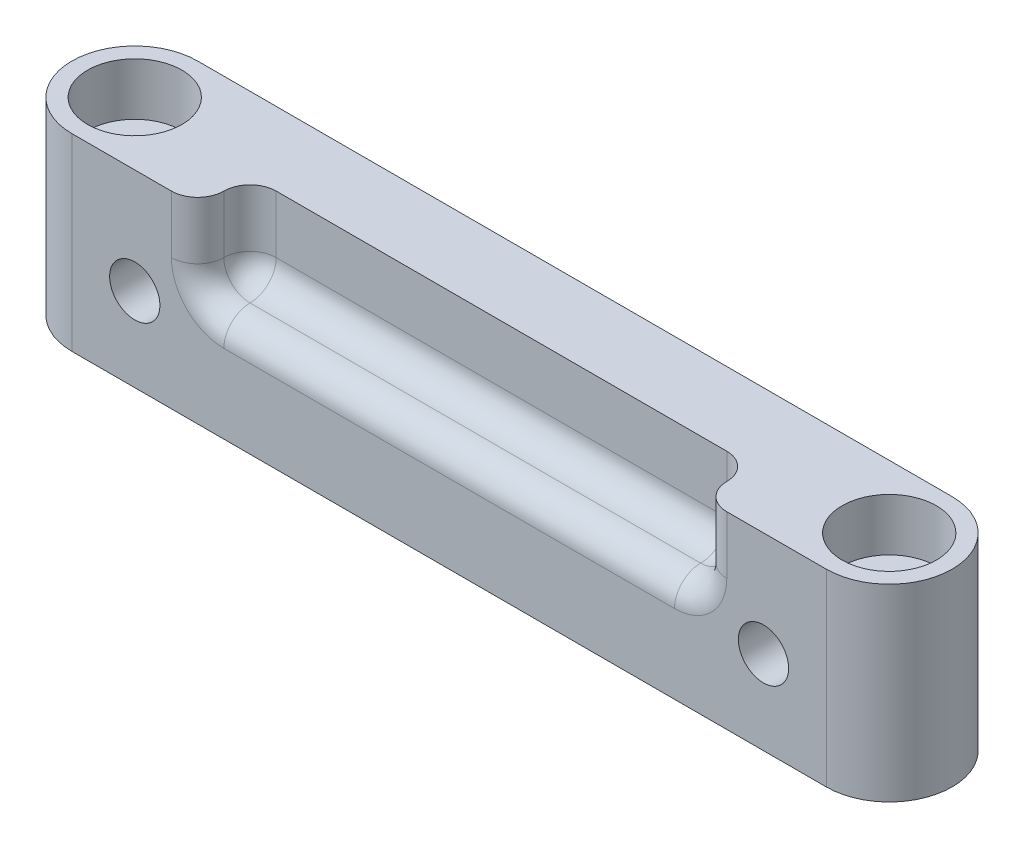
ISO-10303-21;
HEADER;
FILE_DESCRIPTION(('STEP AP214'),'2;1');
FILE_NAME('part.step','',(''),(''),'','','');
FILE_SCHEMA(('AUTOMOTIVE_DESIGN { 1 0 10303 214 1 1 1 1 }'));
ENDSEC;
DATA;
#1=APPLICATION_CONTEXT('core data for automotive mechanical design processes');
#2=APPLICATION_PROTOCOL_DEFINITION('international standard','automotive_design',2000,#1);
#3=PRODUCT_CONTEXT('',#1,'mechanical');
#4=PRODUCT('Part','Part','',(#3));
#5=PRODUCT_RELATED_PRODUCT_CATEGORY('part','',(#4));
#6=PRODUCT_DEFINITION_FORMATION('','',#4);
#7=PRODUCT_DEFINITION_CONTEXT('part definition',#1,'design');
#8=PRODUCT_DEFINITION('design','',#6,#7);
#9=PRODUCT_DEFINITION_SHAPE('','',#8);
#10=(LENGTH_UNIT() NAMED_UNIT(*) SI_UNIT(.MILLI.,.METRE.));
#11=(NAMED_UNIT(*) PLANE_ANGLE_UNIT() SI_UNIT($,.RADIAN.));
#12=(NAMED_UNIT(*) SI_UNIT($,.STERADIAN.) SOLID_ANGLE_UNIT());
#13=UNCERTAINTY_MEASURE_WITH_UNIT(LENGTH_MEASURE(1.E-05),#10,'distance_accuracy_value','');
#14=(GEOMETRIC_REPRESENTATION_CONTEXT(3) GLOBAL_UNCERTAINTY_ASSIGNED_CONTEXT((#13)) GLOBAL_UNIT_ASSIGNED_CONTEXT((#10,
#11,#12)) REPRESENTATION_CONTEXT('',''));
#15=CARTESIAN_POINT('',(0.,0.,0.));
#16=DIRECTION('',(0.,0.,1.));
#17=DIRECTION('',(1.,0.,0.));
#18=AXIS2_PLACEMENT_3D('',#15,#16,#17);
#19=CARTESIAN_POINT('',(36.,9.,0.));
#20=DIRECTION('',(0.,-1.,0.));
#21=DIRECTION('',(0.,0.,-1.));
#22=AXIS2_PLACEMENT_3D('',#19,#20,#21);
#23=CYLINDRICAL_SURFACE('',#22,2.4);
#24=CARTESIAN_POINT('',(36.,-9.,0.));
#25=DIRECTION('',(0.,1.,0.));
#26=DIRECTION('',(0.,0.,1.));
#27=AXIS2_PLACEMENT_3D('',#24,#25,#26);
#28=CIRCLE('',#27,2.4);
#29=CARTESIAN_POINT('',(36.,-9.,2.39999999999999));
#30=VERTEX_POINT('',#29);
#31=EDGE_CURVE('E219',#30,#30,#28,.T.);
#32=ORIENTED_EDGE('',*,*,#31,.F.);
#33=EDGE_LOOP('',(#32));
#34=FACE_BOUND('',#33,.T.);
#35=CARTESIAN_POINT('',(36.,4.,0.));
#36=DIRECTION('',(0.,1.,0.));
#37=DIRECTION('',(0.,0.,1.));
#38=AXIS2_PLACEMENT_3D('',#35,#36,#37);
#39=CIRCLE('',#38,2.4);
#40=CARTESIAN_POINT('',(36.,4.,2.39999999999999));
#41=VERTEX_POINT('',#40);
#42=EDGE_CURVE('E189',#41,#41,#39,.T.);
#43=ORIENTED_EDGE('',*,*,#42,.T.);
#44=EDGE_LOOP('',(#43));
#45=FACE_BOUND('',#44,.T.);
#46=ADVANCED_FACE('F32',(#34,#45),#23,.F.);
#47=CARTESIAN_POINT('',(-36.,9.,0.));
#48=DIRECTION('',(0.,-1.,0.));
#49=DIRECTION('',(0.,0.,-1.));
#50=AXIS2_PLACEMENT_3D('',#47,#48,#49);
#51=CYLINDRICAL_SURFACE('',#50,2.4);
#52=CARTESIAN_POINT('',(-36.,-9.,0.));
#53=DIRECTION('',(0.,1.,0.));
#54=DIRECTION('',(0.,0.,1.));
#55=AXIS2_PLACEMENT_3D('',#52,#53,#54);
#56=CIRCLE('',#55,2.4);
#57=CARTESIAN_POINT('',(-36.,-9.,2.4));
#58=VERTEX_POINT('',#57);
#59=EDGE_CURVE('E197',#58,#58,#56,.T.);
#60=ORIENTED_EDGE('',*,*,#59,.F.);
#61=EDGE_LOOP('',(#60));
#62=FACE_BOUND('',#61,.T.);
#63=CARTESIAN_POINT('',(-36.,4.,0.));
#64=DIRECTION('',(0.,1.,0.));
#65=DIRECTION('',(0.,0.,1.));
#66=AXIS2_PLACEMENT_3D('',#63,#64,#65);
#67=CIRCLE('',#66,2.4);
#68=CARTESIAN_POINT('',(-36.,4.,2.4));
#69=VERTEX_POINT('',#68);
#70=EDGE_CURVE('E194',#69,#69,#67,.T.);
#71=ORIENTED_EDGE('',*,*,#70,.T.);
#72=EDGE_LOOP('',(#71));
#73=FACE_BOUND('',#72,.T.);
#74=ADVANCED_FACE('F288',(#62,#73),#51,.F.);
#75=CARTESIAN_POINT('',(36.,9.,0.));
#76=DIRECTION('',(0.,1.,0.));
#77=DIRECTION('',(0.,0.,1.));
#78=AXIS2_PLACEMENT_3D('',#75,#76,#77);
#79=PLANE('',#78);
#80=DIRECTION('',(1.,0.,0.));
#81=VECTOR('',#80,1.);
#82=CARTESIAN_POINT('',(36.,9.,5.99999999999999));
#83=LINE('',#82,#81);
#84=CARTESIAN_POINT('',(-36.,9.,6.));
#85=VERTEX_POINT('',#84);
#86=CARTESIAN_POINT('',(-26.5,9.,6.));
#87=VERTEX_POINT('',#86);
#88=EDGE_CURVE('E209',#85,#87,#83,.T.);
#89=ORIENTED_EDGE('',*,*,#88,.T.);
#90=CARTESIAN_POINT('',(-26.5,9.,3.5));
#91=DIRECTION('',(0.,1.,0.));
#92=DIRECTION('',(0.,0.,1.));
#93=AXIS2_PLACEMENT_3D('',#90,#91,#92);
#94=CIRCLE('',#93,2.5);
#95=CARTESIAN_POINT('',(-24.,9.,3.5));
#96=VERTEX_POINT('',#95);
#97=EDGE_CURVE('E136',#87,#96,#94,.T.);
#98=ORIENTED_EDGE('',*,*,#97,.T.);
#99=CARTESIAN_POINT('',(-21.5,9.,3.5));
#100=DIRECTION('',(0.,1.,0.));
#101=DIRECTION('',(0.,0.,1.));
#102=AXIS2_PLACEMENT_3D('',#99,#100,#101);
#103=CIRCLE('',#102,2.5);
#104=CARTESIAN_POINT('',(-21.5,9.,0.999999999999998));
#105=VERTEX_POINT('',#104);
#106=EDGE_CURVE('E42',#96,#105,#103,.F.);
#107=ORIENTED_EDGE('',*,*,#106,.T.);
#108=DIRECTION('',(-1.,0.,0.));
#109=VECTOR('',#108,1.);
#110=CARTESIAN_POINT('',(24.,9.,0.999999999999992));
#111=LINE('',#110,#109);
#112=CARTESIAN_POINT('',(21.5,9.,0.999999999999993));
#113=VERTEX_POINT('',#112);
#114=EDGE_CURVE('E241',#113,#105,#111,.T.);
#115=ORIENTED_EDGE('',*,*,#114,.F.);
#116=CARTESIAN_POINT('',(21.5,9.,3.49999999999999));
#117=DIRECTION('',(0.,1.,0.));
#118=DIRECTION('',(0.,0.,1.));
#119=AXIS2_PLACEMENT_3D('',#116,#117,#118);
#120=CIRCLE('',#119,2.5);
#121=CARTESIAN_POINT('',(24.,9.,3.49999999999999));
#122=VERTEX_POINT('',#121);
#123=EDGE_CURVE('E11',#113,#122,#120,.F.);
#124=ORIENTED_EDGE('',*,*,#123,.T.);
#125=CARTESIAN_POINT('',(26.5,9.,3.49999999999999));
#126=DIRECTION('',(0.,1.,0.));
#127=DIRECTION('',(0.,0.,1.));
#128=AXIS2_PLACEMENT_3D('',#125,#126,#127);
#129=CIRCLE('',#128,2.5);
#130=CARTESIAN_POINT('',(26.5,9.,5.99999999999999));
#131=VERTEX_POINT('',#130);
#132=EDGE_CURVE('E137',#122,#131,#129,.T.);
#133=ORIENTED_EDGE('',*,*,#132,.T.);
#134=CARTESIAN_POINT('',(36.,9.,5.99999999999999));
#135=VERTEX_POINT('',#134);
#136=EDGE_CURVE('E221',#131,#135,#83,.T.);
#137=ORIENTED_EDGE('',*,*,#136,.T.);
#138=CARTESIAN_POINT('',(36.,9.,0.));
#139=DIRECTION('',(0.,1.,0.));
#140=DIRECTION('',(0.,0.,1.));
#141=AXIS2_PLACEMENT_3D('',#138,#139,#140);
#142=CIRCLE('',#141,6.);
#143=CARTESIAN_POINT('',(36.,9.,-6.00000000000002));
#144=VERTEX_POINT('',#143);
#145=EDGE_CURVE('E212',#135,#144,#142,.T.);
#146=ORIENTED_EDGE('',*,*,#145,.T.);
#147=DIRECTION('',(-1.,0.,0.));
#148=VECTOR('',#147,1.);
#149=CARTESIAN_POINT('',(36.,9.,-6.00000000000002));
#150=LINE('',#149,#148);
#151=CARTESIAN_POINT('',(-36.,9.,-6.));
#152=VERTEX_POINT('',#151);
#153=EDGE_CURVE('E225',#144,#152,#150,.T.);
#154=ORIENTED_EDGE('',*,*,#153,.T.);
#155=CARTESIAN_POINT('',(-36.,9.,0.));
#156=DIRECTION('',(0.,1.,0.));
#157=DIRECTION('',(0.,0.,1.));
#158=AXIS2_PLACEMENT_3D('',#155,#156,#157);
#159=CIRCLE('',#158,6.);
#160=EDGE_CURVE('E222',#152,#85,#159,.T.);
#161=ORIENTED_EDGE('',*,*,#160,.T.);
#162=EDGE_LOOP('',(#89,#98,#107,#115,#124,#133,#137,#146,#154,#161));
#163=FACE_BOUND('',#162,.T.);
#164=CARTESIAN_POINT('',(36.,9.,0.));
#165=DIRECTION('',(0.,1.,0.));
#166=DIRECTION('',(0.,0.,1.));
#167=AXIS2_PLACEMENT_3D('',#164,#165,#166);
#168=CIRCLE('',#167,4.5);
#169=CARTESIAN_POINT('',(36.,9.,4.49999999999998));
#170=VERTEX_POINT('',#169);
#171=EDGE_CURVE('E238',#170,#170,#168,.T.);
#172=ORIENTED_EDGE('',*,*,#171,.F.);
#173=EDGE_LOOP('',(#172));
#174=FACE_BOUND('',#173,.T.);
#175=CARTESIAN_POINT('',(-36.,9.,0.));
#176=DIRECTION('',(0.,1.,0.));
#177=DIRECTION('',(0.,0.,1.));
#178=AXIS2_PLACEMENT_3D('',#175,#176,#177);
#179=CIRCLE('',#178,4.5);
#180=CARTESIAN_POINT('',(-36.,9.,4.5));
#181=VERTEX_POINT('',#180);
#182=EDGE_CURVE('E192',#181,#181,#179,.T.);
#183=ORIENTED_EDGE('',*,*,#182,.F.);
#184=EDGE_LOOP('',(#183));
#185=FACE_BOUND('',#184,.T.);
#186=ADVANCED_FACE('F294',(#163,#174,#185),#79,.T.);
#187=CARTESIAN_POINT('',(36.,-9.,0.));
#188=DIRECTION('',(0.,1.,0.));
#189=DIRECTION('',(0.,0.,1.));
#190=AXIS2_PLACEMENT_3D('',#187,#188,#189);
#191=PLANE('',#190);
#192=CARTESIAN_POINT('',(36.,-9.,0.));
#193=DIRECTION('',(0.,1.,0.));
#194=DIRECTION('',(0.,0.,1.));
#195=AXIS2_PLACEMENT_3D('',#192,#193,#194);
#196=CIRCLE('',#195,6.);
#197=CARTESIAN_POINT('',(36.,-9.,5.99999999999999));
#198=VERTEX_POINT('',#197);
#199=CARTESIAN_POINT('',(36.,-9.,-6.00000000000002));
#200=VERTEX_POINT('',#199);
#201=EDGE_CURVE('E216',#198,#200,#196,.T.);
#202=ORIENTED_EDGE('',*,*,#201,.F.);
#203=DIRECTION('',(1.,0.,0.));
#204=VECTOR('',#203,1.);
#205=CARTESIAN_POINT('',(36.,-9.,5.99999999999999));
#206=LINE('',#205,#204);
#207=CARTESIAN_POINT('',(-36.,-9.,6.));
#208=VERTEX_POINT('',#207);
#209=EDGE_CURVE('E210',#208,#198,#206,.T.);
#210=ORIENTED_EDGE('',*,*,#209,.F.);
#211=CARTESIAN_POINT('',(-36.,-9.,0.));
#212=DIRECTION('',(0.,1.,0.));
#213=DIRECTION('',(0.,0.,1.));
#214=AXIS2_PLACEMENT_3D('',#211,#212,#213);
#215=CIRCLE('',#214,6.);
#216=CARTESIAN_POINT('',(-36.,-9.,-6.));
#217=VERTEX_POINT('',#216);
#218=EDGE_CURVE('E213',#217,#208,#215,.T.);
#219=ORIENTED_EDGE('',*,*,#218,.F.);
#220=DIRECTION('',(-1.,0.,0.));
#221=VECTOR('',#220,1.);
#222=CARTESIAN_POINT('',(36.,-9.,-6.00000000000002));
#223=LINE('',#222,#221);
#224=EDGE_CURVE('E82',#200,#217,#223,.T.);
#225=ORIENTED_EDGE('',*,*,#224,.F.);
#226=EDGE_LOOP('',(#202,#210,#219,#225));
#227=FACE_BOUND('',#226,.T.);
#228=ORIENTED_EDGE('',*,*,#31,.T.);
#229=EDGE_LOOP('',(#228));
#230=FACE_BOUND('',#229,.T.);
#231=ORIENTED_EDGE('',*,*,#59,.T.);
#232=EDGE_LOOP('',(#231));
#233=FACE_BOUND('',#232,.T.);
#234=ADVANCED_FACE('F303',(#227,#230,#233),#191,.F.);
#235=CARTESIAN_POINT('',(36.,9.,0.));
#236=DIRECTION('',(0.,-1.,0.));
#237=DIRECTION('',(0.,0.,-1.));
#238=AXIS2_PLACEMENT_3D('',#235,#236,#237);
#239=CYLINDRICAL_SURFACE('',#238,6.);
#240=ORIENTED_EDGE('',*,*,#201,.T.);
#241=DIRECTION('',(0.,-1.,0.));
#242=VECTOR('',#241,1.);
#243=CARTESIAN_POINT('',(36.,9.,-6.00000000000002));
#244=LINE('',#243,#242);
#245=EDGE_CURVE('E188',#144,#200,#244,.T.);
#246=ORIENTED_EDGE('',*,*,#245,.F.);
#247=ORIENTED_EDGE('',*,*,#145,.F.);
#248=DIRECTION('',(0.,-1.,0.));
#249=VECTOR('',#248,1.);
#250=CARTESIAN_POINT('',(36.,9.,5.99999999999999));
#251=LINE('',#250,#249);
#252=EDGE_CURVE('E206',#135,#198,#251,.T.);
#253=ORIENTED_EDGE('',*,*,#252,.T.);
#254=EDGE_LOOP('',(#240,#246,#247,#253));
#255=FACE_BOUND('',#254,.T.);
#256=ADVANCED_FACE('F305',(#255),#239,.T.);
#257=CARTESIAN_POINT('',(36.,9.,-6.00000000000002));
#258=DIRECTION('',(0.,0.,1.));
#259=DIRECTION('',(1.,0.,0.));
#260=AXIS2_PLACEMENT_3D('',#257,#258,#259);
#261=PLANE('',#260);
#262=CARTESIAN_POINT('',(30.,-0.999999999999994,-6.00000000000002));
#263=DIRECTION('',(0.,0.,1.));
#264=DIRECTION('',(1.,0.,0.));
#265=AXIS2_PLACEMENT_3D('',#262,#263,#264);
#266=CIRCLE('',#265,2.4);
#267=CARTESIAN_POINT('',(32.4,-0.999999999999994,-6.00000000000002));
#268=VERTEX_POINT('',#267);
#269=EDGE_CURVE('E249',#268,#268,#266,.T.);
#270=ORIENTED_EDGE('',*,*,#269,.T.);
#271=EDGE_LOOP('',(#270));
#272=FACE_BOUND('',#271,.T.);
#273=CARTESIAN_POINT('',(-30.,-1.,-6.00000000000002));
#274=DIRECTION('',(0.,0.,1.));
#275=DIRECTION('',(1.,0.,0.));
#276=AXIS2_PLACEMENT_3D('',#273,#274,#275);
#277=CIRCLE('',#276,2.4);
#278=CARTESIAN_POINT('',(-27.6,-1.,-6.00000000000002));
#279=VERTEX_POINT('',#278);
#280=EDGE_CURVE('E170',#279,#279,#277,.T.);
#281=ORIENTED_EDGE('',*,*,#280,.T.);
#282=EDGE_LOOP('',(#281));
#283=FACE_BOUND('',#282,.T.);
#284=ORIENTED_EDGE('',*,*,#224,.T.);
#285=DIRECTION('',(0.,-1.,0.));
#286=VECTOR('',#285,1.);
#287=CARTESIAN_POINT('',(-36.,9.,-6.));
#288=LINE('',#287,#286);
#289=EDGE_CURVE('E200',#152,#217,#288,.T.);
#290=ORIENTED_EDGE('',*,*,#289,.F.);
#291=ORIENTED_EDGE('',*,*,#153,.F.);
#292=ORIENTED_EDGE('',*,*,#245,.T.);
#293=EDGE_LOOP('',(#284,#290,#291,#292));
#294=FACE_BOUND('',#293,.T.);
#295=ADVANCED_FACE('F258',(#272,#283,#294),#261,.F.);
#296=CARTESIAN_POINT('',(-36.,9.,0.));
#297=DIRECTION('',(0.,-1.,0.));
#298=DIRECTION('',(0.,0.,-1.));
#299=AXIS2_PLACEMENT_3D('',#296,#297,#298);
#300=CYLINDRICAL_SURFACE('',#299,6.);
#301=ORIENTED_EDGE('',*,*,#218,.T.);
#302=DIRECTION('',(0.,-1.,0.));
#303=VECTOR('',#302,1.);
#304=CARTESIAN_POINT('',(-36.,9.,6.));
#305=LINE('',#304,#303);
#306=EDGE_CURVE('E203',#85,#208,#305,.T.);
#307=ORIENTED_EDGE('',*,*,#306,.F.);
#308=ORIENTED_EDGE('',*,*,#160,.F.);
#309=ORIENTED_EDGE('',*,*,#289,.T.);
#310=EDGE_LOOP('',(#301,#307,#308,#309));
#311=FACE_BOUND('',#310,.T.);
#312=ADVANCED_FACE('F271',(#311),#300,.T.);
#313=CARTESIAN_POINT('',(36.,9.,5.99999999999999));
#314=DIRECTION('',(0.,0.,-1.));
#315=DIRECTION('',(-1.,0.,0.));
#316=AXIS2_PLACEMENT_3D('',#313,#314,#315);
#317=PLANE('',#316);
#318=CARTESIAN_POINT('',(30.,-0.999999999999994,5.99999999999999));
#319=DIRECTION('',(0.,0.,1.));
#320=DIRECTION('',(1.,0.,0.));
#321=AXIS2_PLACEMENT_3D('',#318,#319,#320);
#322=CIRCLE('',#321,2.4);
#323=CARTESIAN_POINT('',(32.4,-0.999999999999994,5.99999999999999));
#324=VERTEX_POINT('',#323);
#325=EDGE_CURVE('E252',#324,#324,#322,.T.);
#326=ORIENTED_EDGE('',*,*,#325,.F.);
#327=EDGE_LOOP('',(#326));
#328=FACE_BOUND('',#327,.T.);
#329=CARTESIAN_POINT('',(-30.,-1.,5.99999999999999));
#330=DIRECTION('',(0.,0.,1.));
#331=DIRECTION('',(1.,0.,0.));
#332=AXIS2_PLACEMENT_3D('',#329,#330,#331);
#333=CIRCLE('',#332,2.4);
#334=CARTESIAN_POINT('',(-27.6,-1.,5.99999999999999));
#335=VERTEX_POINT('',#334);
#336=EDGE_CURVE('E246',#335,#335,#333,.T.);
#337=ORIENTED_EDGE('',*,*,#336,.F.);
#338=EDGE_LOOP('',(#337));
#339=FACE_BOUND('',#338,.T.);
#340=CARTESIAN_POINT('',(-21.5,3.5,6.));
#341=DIRECTION('',(0.,0.,-1.));
#342=DIRECTION('',(-1.,0.,0.));
#343=AXIS2_PLACEMENT_3D('',#340,#341,#342);
#344=CIRCLE('',#343,5.);
#345=CARTESIAN_POINT('',(-26.5,3.5,6.));
#346=VERTEX_POINT('',#345);
#347=CARTESIAN_POINT('',(-21.5,-1.5,6.));
#348=VERTEX_POINT('',#347);
#349=EDGE_CURVE('E124',#346,#348,#344,.F.);
#350=ORIENTED_EDGE('',*,*,#349,.F.);
#351=DIRECTION('',(0.,1.,0.));
#352=VECTOR('',#351,1.);
#353=CARTESIAN_POINT('',(-26.5,9.,6.));
#354=LINE('',#353,#352);
#355=EDGE_CURVE('E127',#346,#87,#354,.T.);
#356=ORIENTED_EDGE('',*,*,#355,.T.);
#357=ORIENTED_EDGE('',*,*,#88,.F.);
#358=ORIENTED_EDGE('',*,*,#306,.T.);
#359=ORIENTED_EDGE('',*,*,#209,.T.);
#360=ORIENTED_EDGE('',*,*,#252,.F.);
#361=ORIENTED_EDGE('',*,*,#136,.F.);
#362=DIRECTION('',(0.,1.,0.));
#363=VECTOR('',#362,1.);
#364=CARTESIAN_POINT('',(26.5,9.,5.99999999999999));
#365=LINE('',#364,#363);
#366=CARTESIAN_POINT('',(26.5,3.5,5.99999999999999));
#367=VERTEX_POINT('',#366);
#368=EDGE_CURVE('E176',#131,#367,#365,.F.);
#369=ORIENTED_EDGE('',*,*,#368,.T.);
#370=CARTESIAN_POINT('',(21.5,3.5,5.99999999999999));
#371=DIRECTION('',(0.,0.,-1.));
#372=DIRECTION('',(-1.,0.,0.));
#373=AXIS2_PLACEMENT_3D('',#370,#371,#372);
#374=CIRCLE('',#373,5.);
#375=CARTESIAN_POINT('',(21.5,-1.5,5.99999999999999));
#376=VERTEX_POINT('',#375);
#377=EDGE_CURVE('E178',#376,#367,#374,.F.);
#378=ORIENTED_EDGE('',*,*,#377,.F.);
#379=DIRECTION('',(1.,0.,0.));
#380=VECTOR('',#379,1.);
#381=CARTESIAN_POINT('',(36.,-1.5,5.99999999999999));
#382=LINE('',#381,#380);
#383=EDGE_CURVE('E130',#376,#348,#382,.F.);
#384=ORIENTED_EDGE('',*,*,#383,.T.);
#385=EDGE_LOOP('',(#350,#356,#357,#358,#359,#360,#361,#369,#378,#384));
#386=FACE_BOUND('',#385,.T.);
#387=ADVANCED_FACE('F125',(#328,#339,#386),#317,.F.);
#388=CARTESIAN_POINT('',(-36.,4.,0.));
#389=DIRECTION('',(0.,1.,0.));
#390=DIRECTION('',(0.,0.,1.));
#391=AXIS2_PLACEMENT_3D('',#388,#389,#390);
#392=CYLINDRICAL_SURFACE('',#391,4.5);
#393=CARTESIAN_POINT('',(-36.,4.,0.));
#394=DIRECTION('',(0.,1.,0.));
#395=DIRECTION('',(0.,0.,1.));
#396=AXIS2_PLACEMENT_3D('',#393,#394,#395);
#397=CIRCLE('',#396,4.5);
#398=CARTESIAN_POINT('',(-36.,4.,4.5));
#399=VERTEX_POINT('',#398);
#400=EDGE_CURVE('E198',#399,#399,#397,.T.);
#401=ORIENTED_EDGE('',*,*,#400,.F.);
#402=EDGE_LOOP('',(#401));
#403=FACE_BOUND('',#402,.T.);
#404=ORIENTED_EDGE('',*,*,#182,.T.);
#405=EDGE_LOOP('',(#404));
#406=FACE_BOUND('',#405,.T.);
#407=ADVANCED_FACE('F270',(#403,#406),#392,.F.);
#408=CARTESIAN_POINT('',(-36.,4.,0.));
#409=DIRECTION('',(0.,1.,0.));
#410=DIRECTION('',(0.,0.,1.));
#411=AXIS2_PLACEMENT_3D('',#408,#409,#410);
#412=PLANE('',#411);
#413=ORIENTED_EDGE('',*,*,#70,.F.);
#414=EDGE_LOOP('',(#413));
#415=FACE_BOUND('',#414,.T.);
#416=ORIENTED_EDGE('',*,*,#400,.T.);
#417=EDGE_LOOP('',(#416));
#418=FACE_BOUND('',#417,.T.);
#419=ADVANCED_FACE('F382',(#415,#418),#412,.T.);
#420=CARTESIAN_POINT('',(36.,4.,0.));
#421=DIRECTION('',(0.,1.,0.));
#422=DIRECTION('',(0.,0.,1.));
#423=AXIS2_PLACEMENT_3D('',#420,#421,#422);
#424=CYLINDRICAL_SURFACE('',#423,4.5);
#425=CARTESIAN_POINT('',(36.,4.,0.));
#426=DIRECTION('',(0.,1.,0.));
#427=DIRECTION('',(0.,0.,1.));
#428=AXIS2_PLACEMENT_3D('',#425,#426,#427);
#429=CIRCLE('',#428,4.5);
#430=CARTESIAN_POINT('',(36.,4.,4.49999999999998));
#431=VERTEX_POINT('',#430);
#432=EDGE_CURVE('E193',#431,#431,#429,.T.);
#433=ORIENTED_EDGE('',*,*,#432,.F.);
#434=EDGE_LOOP('',(#433));
#435=FACE_BOUND('',#434,.T.);
#436=ORIENTED_EDGE('',*,*,#171,.T.);
#437=EDGE_LOOP('',(#436));
#438=FACE_BOUND('',#437,.T.);
#439=ADVANCED_FACE('F385',(#435,#438),#424,.F.);
#440=CARTESIAN_POINT('',(36.,4.,0.));
#441=DIRECTION('',(0.,1.,0.));
#442=DIRECTION('',(0.,0.,1.));
#443=AXIS2_PLACEMENT_3D('',#440,#441,#442);
#444=PLANE('',#443);
#445=ORIENTED_EDGE('',*,*,#42,.F.);
#446=EDGE_LOOP('',(#445));
#447=FACE_BOUND('',#446,.T.);
#448=ORIENTED_EDGE('',*,*,#432,.T.);
#449=EDGE_LOOP('',(#448));
#450=FACE_BOUND('',#449,.T.);
#451=ADVANCED_FACE('F347',(#447,#450),#444,.T.);
#452=CARTESIAN_POINT('',(24.,0.999999999999999,0.999999999999992));
#453=DIRECTION('',(0.,0.,-1.));
#454=DIRECTION('',(-1.,0.,0.));
#455=AXIS2_PLACEMENT_3D('',#452,#453,#454);
#456=PLANE('',#455);
#457=ORIENTED_EDGE('',*,*,#114,.T.);
#458=DIRECTION('',(0.,1.,0.));
#459=VECTOR('',#458,1.);
#460=CARTESIAN_POINT('',(-21.5,0.999999999999999,0.999999999999998));
#461=LINE('',#460,#459);
#462=CARTESIAN_POINT('',(-21.5,3.5,0.999999999999998));
#463=VERTEX_POINT('',#462);
#464=EDGE_CURVE('E181',#105,#463,#461,.F.);
#465=ORIENTED_EDGE('',*,*,#464,.T.);
#466=DIRECTION('',(-1.,0.,0.));
#467=VECTOR('',#466,1.);
#468=CARTESIAN_POINT('',(24.,3.5,0.999999999999992));
#469=LINE('',#468,#467);
#470=CARTESIAN_POINT('',(21.5,3.5,0.999999999999993));
#471=VERTEX_POINT('',#470);
#472=EDGE_CURVE('E183',#463,#471,#469,.F.);
#473=ORIENTED_EDGE('',*,*,#472,.T.);
#474=DIRECTION('',(0.,1.,0.));
#475=VECTOR('',#474,1.);
#476=CARTESIAN_POINT('',(21.5,9.,0.999999999999993));
#477=LINE('',#476,#475);
#478=EDGE_CURVE('E186',#471,#113,#477,.T.);
#479=ORIENTED_EDGE('',*,*,#478,.T.);
#480=EDGE_LOOP('',(#457,#465,#473,#479));
#481=FACE_BOUND('',#480,.T.);
#482=ADVANCED_FACE('F343',(#481),#456,.F.);
#483=CARTESIAN_POINT('',(26.5,0.999999999999999,3.49999999999999));
#484=DIRECTION('',(0.,1.,0.));
#485=DIRECTION('',(0.,0.,1.));
#486=AXIS2_PLACEMENT_3D('',#483,#484,#485);
#487=CYLINDRICAL_SURFACE('',#486,2.5);
#488=ORIENTED_EDGE('',*,*,#368,.F.);
#489=ORIENTED_EDGE('',*,*,#132,.F.);
#490=DIRECTION('',(0.,1.,0.));
#491=VECTOR('',#490,1.);
#492=CARTESIAN_POINT('',(24.,0.999999999999999,3.49999999999999));
#493=LINE('',#492,#491);
#494=CARTESIAN_POINT('',(24.,3.5,3.49999999999999));
#495=VERTEX_POINT('',#494);
#496=EDGE_CURVE('E36',#495,#122,#493,.T.);
#497=ORIENTED_EDGE('',*,*,#496,.F.);
#498=CARTESIAN_POINT('',(26.5,3.5,3.49999999999999));
#499=DIRECTION('',(0.,-1.,0.));
#500=DIRECTION('',(0.,0.,-1.));
#501=AXIS2_PLACEMENT_3D('',#498,#499,#500);
#502=CIRCLE('',#501,2.5);
#503=EDGE_CURVE('E143',#367,#495,#502,.T.);
#504=ORIENTED_EDGE('',*,*,#503,.F.);
#505=EDGE_LOOP('',(#488,#489,#497,#504));
#506=FACE_BOUND('',#505,.T.);
#507=ADVANCED_FACE('F34',(#506),#487,.T.);
#508=CARTESIAN_POINT('',(-26.5,9.,3.5));
#509=DIRECTION('',(0.,1.,0.));
#510=DIRECTION('',(0.,0.,1.));
#511=AXIS2_PLACEMENT_3D('',#508,#509,#510);
#512=CYLINDRICAL_SURFACE('',#511,2.5);
#513=ORIENTED_EDGE('',*,*,#97,.F.);
#514=ORIENTED_EDGE('',*,*,#355,.F.);
#515=CARTESIAN_POINT('',(-26.5,3.5,3.5));
#516=DIRECTION('',(0.,-1.,0.));
#517=DIRECTION('',(0.,0.,-1.));
#518=AXIS2_PLACEMENT_3D('',#515,#516,#517);
#519=CIRCLE('',#518,2.5);
#520=CARTESIAN_POINT('',(-24.,3.5,3.5));
#521=VERTEX_POINT('',#520);
#522=EDGE_CURVE('E67',#521,#346,#519,.T.);
#523=ORIENTED_EDGE('',*,*,#522,.F.);
#524=DIRECTION('',(0.,1.,0.));
#525=VECTOR('',#524,1.);
#526=CARTESIAN_POINT('',(-24.,0.999999999999999,3.5));
#527=LINE('',#526,#525);
#528=EDGE_CURVE('E146',#96,#521,#527,.F.);
#529=ORIENTED_EDGE('',*,*,#528,.F.);
#530=EDGE_LOOP('',(#513,#514,#523,#529));
#531=FACE_BOUND('',#530,.T.);
#532=ADVANCED_FACE('F135',(#531),#512,.T.);
#533=CARTESIAN_POINT('',(21.5,0.999999999999999,3.49999999999999));
#534=DIRECTION('',(0.,-1.,0.));
#535=DIRECTION('',(0.,0.,-1.));
#536=AXIS2_PLACEMENT_3D('',#533,#534,#535);
#537=CYLINDRICAL_SURFACE('',#536,2.5);
#538=CARTESIAN_POINT('',(21.5,3.5,3.49999999999999));
#539=DIRECTION('',(0.,1.,0.));
#540=DIRECTION('',(0.,0.,1.));
#541=AXIS2_PLACEMENT_3D('',#538,#539,#540);
#542=CIRCLE('',#541,2.5);
#543=EDGE_CURVE('E150',#495,#471,#542,.T.);
#544=ORIENTED_EDGE('',*,*,#543,.F.);
#545=ORIENTED_EDGE('',*,*,#496,.T.);
#546=ORIENTED_EDGE('',*,*,#123,.F.);
#547=ORIENTED_EDGE('',*,*,#478,.F.);
#548=EDGE_LOOP('',(#544,#545,#546,#547));
#549=FACE_BOUND('',#548,.T.);
#550=ADVANCED_FACE('F335',(#549),#537,.F.);
#551=CARTESIAN_POINT('',(21.5,3.5,3.49999999999999));
#552=DIRECTION('',(0.,0.,-1.));
#553=DIRECTION('',(-1.,0.,0.));
#554=AXIS2_PLACEMENT_3D('',#551,#552,#553);
#555=TOROIDAL_SURFACE('',#554,5.,2.5);
#556=ORIENTED_EDGE('',*,*,#503,.T.);
#557=CARTESIAN_POINT('',(21.5,3.5,3.49999999999999));
#558=DIRECTION('',(0.,0.,1.));
#559=DIRECTION('',(1.,0.,0.));
#560=AXIS2_PLACEMENT_3D('',#557,#558,#559);
#561=CIRCLE('',#560,2.5);
#562=CARTESIAN_POINT('',(21.5,0.999999999999999,3.49999999999999));
#563=VERTEX_POINT('',#562);
#564=EDGE_CURVE('E153',#563,#495,#561,.T.);
#565=ORIENTED_EDGE('',*,*,#564,.F.);
#566=CARTESIAN_POINT('',(21.5,-1.5,3.49999999999999));
#567=DIRECTION('',(1.,0.,0.));
#568=DIRECTION('',(0.,0.,-1.));
#569=AXIS2_PLACEMENT_3D('',#566,#567,#568);
#570=CIRCLE('',#569,2.5);
#571=EDGE_CURVE('E155',#376,#563,#570,.F.);
#572=ORIENTED_EDGE('',*,*,#571,.F.);
#573=ORIENTED_EDGE('',*,*,#377,.T.);
#574=EDGE_LOOP('',(#556,#565,#572,#573));
#575=FACE_BOUND('',#574,.T.);
#576=ADVANCED_FACE('F332',(#575),#555,.T.);
#577=CARTESIAN_POINT('',(-21.5,3.5,3.5));
#578=DIRECTION('',(0.,0.,-1.));
#579=DIRECTION('',(-1.,0.,0.));
#580=AXIS2_PLACEMENT_3D('',#577,#578,#579);
#581=TOROIDAL_SURFACE('',#580,5.,2.5);
#582=CARTESIAN_POINT('',(-21.5,3.5,3.5));
#583=DIRECTION('',(0.,0.,-1.));
#584=DIRECTION('',(-1.,0.,0.));
#585=AXIS2_PLACEMENT_3D('',#582,#583,#584);
#586=CIRCLE('',#585,2.5);
#587=CARTESIAN_POINT('',(-21.5,0.999999999999999,3.5));
#588=VERTEX_POINT('',#587);
#589=EDGE_CURVE('E141',#521,#588,#586,.F.);
#590=ORIENTED_EDGE('',*,*,#589,.F.);
#591=ORIENTED_EDGE('',*,*,#522,.T.);
#592=ORIENTED_EDGE('',*,*,#349,.T.);
#593=CARTESIAN_POINT('',(-21.5,-1.5,3.5));
#594=DIRECTION('',(-1.,0.,0.));
#595=DIRECTION('',(0.,0.,1.));
#596=AXIS2_PLACEMENT_3D('',#593,#594,#595);
#597=CIRCLE('',#596,2.5);
#598=EDGE_CURVE('E158',#588,#348,#597,.F.);
#599=ORIENTED_EDGE('',*,*,#598,.F.);
#600=EDGE_LOOP('',(#590,#591,#592,#599));
#601=FACE_BOUND('',#600,.T.);
#602=ADVANCED_FACE('F139',(#601),#581,.T.);
#603=CARTESIAN_POINT('',(-21.5,0.999999999999999,3.5));
#604=DIRECTION('',(0.,-1.,0.));
#605=DIRECTION('',(0.,0.,-1.));
#606=AXIS2_PLACEMENT_3D('',#603,#604,#605);
#607=CYLINDRICAL_SURFACE('',#606,2.5);
#608=ORIENTED_EDGE('',*,*,#106,.F.);
#609=ORIENTED_EDGE('',*,*,#528,.T.);
#610=CARTESIAN_POINT('',(-21.5,3.5,3.5));
#611=DIRECTION('',(0.,1.,0.));
#612=DIRECTION('',(0.,0.,1.));
#613=AXIS2_PLACEMENT_3D('',#610,#611,#612);
#614=CIRCLE('',#613,2.5);
#615=EDGE_CURVE('E160',#463,#521,#614,.T.);
#616=ORIENTED_EDGE('',*,*,#615,.F.);
#617=ORIENTED_EDGE('',*,*,#464,.F.);
#618=EDGE_LOOP('',(#608,#609,#616,#617));
#619=FACE_BOUND('',#618,.T.);
#620=ADVANCED_FACE('F325',(#619),#607,.F.);
#621=CARTESIAN_POINT('',(21.5,3.5,3.49999999999999));
#622=DIRECTION('',(0.,0.,1.));
#623=DIRECTION('',(1.,0.,0.));
#624=AXIS2_PLACEMENT_3D('',#621,#622,#623);
#625=SPHERICAL_SURFACE('',#624,2.5);
#626=ORIENTED_EDGE('',*,*,#564,.T.);
#627=ORIENTED_EDGE('',*,*,#543,.T.);
#628=CARTESIAN_POINT('',(21.5,3.5,3.49999999999999));
#629=DIRECTION('',(-1.,0.,0.));
#630=DIRECTION('',(0.,0.,1.));
#631=AXIS2_PLACEMENT_3D('',#628,#629,#630);
#632=CIRCLE('',#631,2.5);
#633=EDGE_CURVE('E163',#563,#471,#632,.F.);
#634=ORIENTED_EDGE('',*,*,#633,.F.);
#635=EDGE_LOOP('',(#626,#627,#634));
#636=FACE_BOUND('',#635,.T.);
#637=ADVANCED_FACE('F321',(#636),#625,.F.);
#638=CARTESIAN_POINT('',(0.,-1.5,3.49999999999999));
#639=DIRECTION('',(1.,0.,0.));
#640=DIRECTION('',(0.,0.,-1.));
#641=AXIS2_PLACEMENT_3D('',#638,#639,#640);
#642=CYLINDRICAL_SURFACE('',#641,2.5);
#643=ORIENTED_EDGE('',*,*,#383,.F.);
#644=ORIENTED_EDGE('',*,*,#571,.T.);
#645=DIRECTION('',(1.,0.,0.));
#646=VECTOR('',#645,1.);
#647=CARTESIAN_POINT('',(0.,0.999999999999999,3.49999999999999));
#648=LINE('',#647,#646);
#649=EDGE_CURVE('E165',#588,#563,#648,.T.);
#650=ORIENTED_EDGE('',*,*,#649,.F.);
#651=ORIENTED_EDGE('',*,*,#598,.T.);
#652=EDGE_LOOP('',(#643,#644,#650,#651));
#653=FACE_BOUND('',#652,.T.);
#654=ADVANCED_FACE('F317',(#653),#642,.T.);
#655=CARTESIAN_POINT('',(-21.5,3.5,3.5));
#656=DIRECTION('',(0.,0.,1.));
#657=DIRECTION('',(1.,0.,0.));
#658=AXIS2_PLACEMENT_3D('',#655,#656,#657);
#659=SPHERICAL_SURFACE('',#658,2.5);
#660=ORIENTED_EDGE('',*,*,#615,.T.);
#661=ORIENTED_EDGE('',*,*,#589,.T.);
#662=CARTESIAN_POINT('',(-21.5,3.5,3.5));
#663=DIRECTION('',(1.,0.,0.));
#664=DIRECTION('',(0.,0.,-1.));
#665=AXIS2_PLACEMENT_3D('',#662,#663,#664);
#666=CIRCLE('',#665,2.5);
#667=EDGE_CURVE('E168',#463,#588,#666,.F.);
#668=ORIENTED_EDGE('',*,*,#667,.F.);
#669=EDGE_LOOP('',(#660,#661,#668));
#670=FACE_BOUND('',#669,.T.);
#671=ADVANCED_FACE('F282',(#670),#659,.F.);
#672=CARTESIAN_POINT('',(0.,3.5,3.5));
#673=DIRECTION('',(1.,0.,0.));
#674=DIRECTION('',(0.,0.,-1.));
#675=AXIS2_PLACEMENT_3D('',#672,#673,#674);
#676=CYLINDRICAL_SURFACE('',#675,2.5);
#677=ORIENTED_EDGE('',*,*,#633,.T.);
#678=ORIENTED_EDGE('',*,*,#472,.F.);
#679=ORIENTED_EDGE('',*,*,#667,.T.);
#680=ORIENTED_EDGE('',*,*,#649,.T.);
#681=EDGE_LOOP('',(#677,#678,#679,#680));
#682=FACE_BOUND('',#681,.T.);
#683=ADVANCED_FACE('F276',(#682),#676,.F.);
#684=CARTESIAN_POINT('',(-30.,-1.,-6.00000000000002));
#685=DIRECTION('',(0.,0.,1.));
#686=DIRECTION('',(1.,0.,0.));
#687=AXIS2_PLACEMENT_3D('',#684,#685,#686);
#688=CYLINDRICAL_SURFACE('',#687,2.4);
#689=ORIENTED_EDGE('',*,*,#280,.F.);
#690=EDGE_LOOP('',(#689));
#691=FACE_BOUND('',#690,.T.);
#692=ORIENTED_EDGE('',*,*,#336,.T.);
#693=EDGE_LOOP('',(#692));
#694=FACE_BOUND('',#693,.T.);
#695=ADVANCED_FACE('F264',(#691,#694),#688,.F.);
#696=CARTESIAN_POINT('',(30.,-0.999999999999994,-6.00000000000002));
#697=DIRECTION('',(0.,0.,1.));
#698=DIRECTION('',(1.,0.,0.));
#699=AXIS2_PLACEMENT_3D('',#696,#697,#698);
#700=CYLINDRICAL_SURFACE('',#699,2.4);
#701=ORIENTED_EDGE('',*,*,#269,.F.);
#702=EDGE_LOOP('',(#701));
#703=FACE_BOUND('',#702,.T.);
#704=ORIENTED_EDGE('',*,*,#325,.T.);
#705=EDGE_LOOP('',(#704));
#706=FACE_BOUND('',#705,.T.);
#707=ADVANCED_FACE('F261',(#703,#706),#700,.F.);
#708=CLOSED_SHELL('',(#46,#74,#186,#234,#256,#295,#312,#387,#407,#419,#439,#451,#482,#507,#532,
#550,#576,#602,#620,#637,#654,#671,#683,#695,#707));
#709=MANIFOLD_SOLID_BREP('B2',#708);
#710=ADVANCED_BREP_SHAPE_REPRESENTATION('',(#18,#709),#14);
#711=SHAPE_DEFINITION_REPRESENTATION(#9,#710);
ENDSEC;
END-ISO-10303-21;
